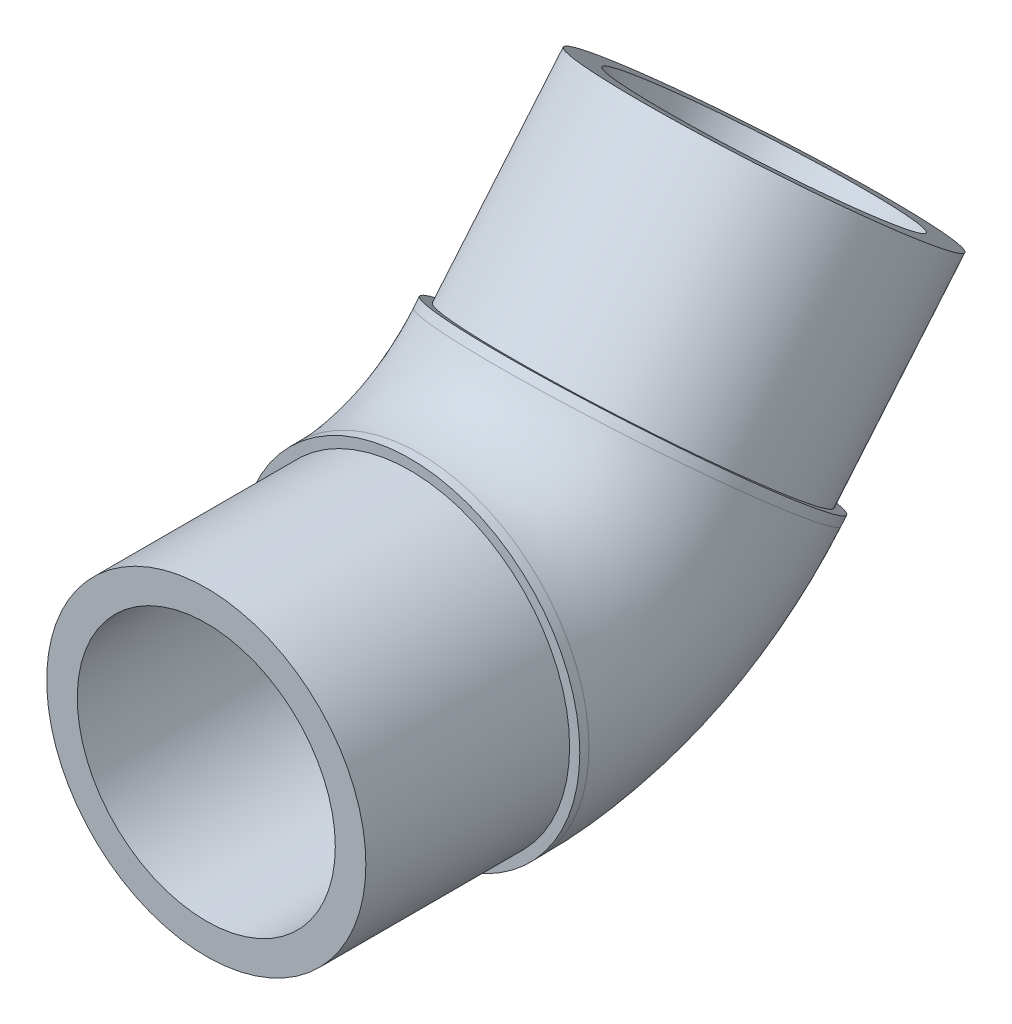
ISO-10303-21;
HEADER;
FILE_DESCRIPTION(('STEP AP214'),'2;1');
FILE_NAME('part.step','',(''),(''),'','','');
FILE_SCHEMA(('AUTOMOTIVE_DESIGN { 1 0 10303 214 1 1 1 1 }'));
ENDSEC;
DATA;
#1=APPLICATION_CONTEXT('core data for automotive mechanical design processes');
#2=APPLICATION_PROTOCOL_DEFINITION('international standard','automotive_design',2000,#1);
#3=PRODUCT_CONTEXT('',#1,'mechanical');
#4=PRODUCT('Part','Part','',(#3));
#5=PRODUCT_RELATED_PRODUCT_CATEGORY('part','',(#4));
#6=PRODUCT_DEFINITION_FORMATION('','',#4);
#7=PRODUCT_DEFINITION_CONTEXT('part definition',#1,'design');
#8=PRODUCT_DEFINITION('design','',#6,#7);
#9=PRODUCT_DEFINITION_SHAPE('','',#8);
#10=(LENGTH_UNIT() NAMED_UNIT(*) SI_UNIT(.MILLI.,.METRE.));
#11=(NAMED_UNIT(*) PLANE_ANGLE_UNIT() SI_UNIT($,.RADIAN.));
#12=(NAMED_UNIT(*) SI_UNIT($,.STERADIAN.) SOLID_ANGLE_UNIT());
#13=UNCERTAINTY_MEASURE_WITH_UNIT(LENGTH_MEASURE(1.E-05),#10,'distance_accuracy_value','');
#14=(GEOMETRIC_REPRESENTATION_CONTEXT(3) GLOBAL_UNCERTAINTY_ASSIGNED_CONTEXT((#13)) GLOBAL_UNIT_ASSIGNED_CONTEXT((#10,
#11,#12)) REPRESENTATION_CONTEXT('',''));
#15=CARTESIAN_POINT('',(0.,0.,0.));
#16=DIRECTION('',(0.,0.,1.));
#17=DIRECTION('',(1.,0.,0.));
#18=AXIS2_PLACEMENT_3D('',#15,#16,#17);
#19=CARTESIAN_POINT('',(0.,14.2884956125385,-61.9894713985592));
#20=DIRECTION('',(0.,0.766044443118979,-0.642787609686538));
#21=DIRECTION('',(0.,0.642787609686538,0.76604444311898));
#22=AXIS2_PLACEMENT_3D('',#19,#20,#21);
#23=CYLINDRICAL_SURFACE('',#22,25.);
#24=CARTESIAN_POINT('',(0.,14.2884956125385,-61.9894713985592));
#25=DIRECTION('',(0.,-0.76604444311898,0.642787609686537));
#26=DIRECTION('',(1.,0.,0.));
#27=AXIS2_PLACEMENT_3D('',#24,#25,#26);
#28=CIRCLE('',#27,25.);
#29=CARTESIAN_POINT('',(0.,-1.78119462962494,-81.1405824765337));
#30=VERTEX_POINT('',#29);
#31=EDGE_CURVE('E50',#30,#30,#28,.T.);
#32=ORIENTED_EDGE('',*,*,#31,.F.);
#33=EDGE_LOOP('',(#32));
#34=FACE_BOUND('',#33,.T.);
#35=CARTESIAN_POINT('',(0.,15.3208888623796,-62.8557521937307));
#36=DIRECTION('',(0.,0.766044443118979,-0.642787609686538));
#37=DIRECTION('',(0.,0.642787609686538,0.766044443118979));
#38=AXIS2_PLACEMENT_3D('',#35,#36,#37);
#39=CIRCLE('',#38,25.);
#40=CARTESIAN_POINT('',(0.,31.3905791045431,-43.7046411157563));
#41=VERTEX_POINT('',#40);
#42=EDGE_CURVE('E34',#41,#41,#39,.T.);
#43=ORIENTED_EDGE('',*,*,#42,.F.);
#44=EDGE_LOOP('',(#43));
#45=FACE_BOUND('',#44,.T.);
#46=ADVANCED_FACE('F31',(#34,#45),#23,.T.);
#47=CARTESIAN_POINT('',(0.,38.302222155949,-82.1393804843269));
#48=DIRECTION('',(0.,-0.766044443118979,0.642787609686538));
#49=DIRECTION('',(1.,0.,0.));
#50=AXIS2_PLACEMENT_3D('',#47,#48,#49);
#51=PLANE('',#50);
#52=CARTESIAN_POINT('',(0.,38.302222155949,-82.1393804843269));
#53=DIRECTION('',(0.,-0.766044443118979,0.642787609686538));
#54=DIRECTION('',(1.,0.,0.));
#55=AXIS2_PLACEMENT_3D('',#52,#53,#54);
#56=CIRCLE('',#55,19.);
#57=CARTESIAN_POINT('',(19.,38.302222155949,-82.1393804843269));
#58=VERTEX_POINT('',#57);
#59=EDGE_CURVE('E10',#58,#58,#56,.F.);
#60=ORIENTED_EDGE('',*,*,#59,.F.);
#61=EDGE_LOOP('',(#60));
#62=FACE_BOUND('',#61,.T.);
#63=CARTESIAN_POINT('',(0.,38.302222155949,-82.1393804843269));
#64=DIRECTION('',(0.,0.766044443118979,-0.642787609686538));
#65=DIRECTION('',(0.,0.642787609686538,0.766044443118979));
#66=AXIS2_PLACEMENT_3D('',#63,#64,#65);
#67=CIRCLE('',#66,23.5);
#68=CARTESIAN_POINT('',(0.,53.4077309835826,-64.1373360710308));
#69=VERTEX_POINT('',#68);
#70=EDGE_CURVE('E66',#69,#69,#67,.T.);
#71=ORIENTED_EDGE('',*,*,#70,.T.);
#72=EDGE_LOOP('',(#71));
#73=FACE_BOUND('',#72,.T.);
#74=ADVANCED_FACE('F91',(#62,#73),#51,.F.);
#75=CARTESIAN_POINT('',(0.,0.,0.));
#76=DIRECTION('',(0.,0.,-1.));
#77=DIRECTION('',(-1.,0.,0.));
#78=AXIS2_PLACEMENT_3D('',#75,#76,#77);
#79=CYLINDRICAL_SURFACE('',#78,25.);
#80=CARTESIAN_POINT('',(0.,0.,-31.3476936738));
#81=DIRECTION('',(0.,0.,1.));
#82=DIRECTION('',(1.,0.,0.));
#83=AXIS2_PLACEMENT_3D('',#80,#81,#82);
#84=CIRCLE('',#83,25.);
#85=CARTESIAN_POINT('',(0.,-25.,-31.3476936738));
#86=VERTEX_POINT('',#85);
#87=EDGE_CURVE('E47',#86,#86,#84,.T.);
#88=ORIENTED_EDGE('',*,*,#87,.T.);
#89=EDGE_LOOP('',(#88));
#90=FACE_BOUND('',#89,.T.);
#91=CARTESIAN_POINT('',(0.,0.,-30.));
#92=DIRECTION('',(0.,0.,1.));
#93=DIRECTION('',(1.,0.,0.));
#94=AXIS2_PLACEMENT_3D('',#91,#92,#93);
#95=CIRCLE('',#94,25.);
#96=CARTESIAN_POINT('',(25.,0.,-30.));
#97=VERTEX_POINT('',#96);
#98=EDGE_CURVE('E51',#97,#97,#95,.T.);
#99=ORIENTED_EDGE('',*,*,#98,.F.);
#100=EDGE_LOOP('',(#99));
#101=FACE_BOUND('',#100,.T.);
#102=ADVANCED_FACE('F96',(#90,#101),#79,.T.);
#103=CARTESIAN_POINT('',(0.,0.,0.));
#104=DIRECTION('',(0.,0.,1.));
#105=DIRECTION('',(1.,0.,0.));
#106=AXIS2_PLACEMENT_3D('',#103,#104,#105);
#107=PLANE('',#106);
#108=CARTESIAN_POINT('',(0.,0.,0.));
#109=DIRECTION('',(0.,0.,1.));
#110=DIRECTION('',(1.,0.,0.));
#111=AXIS2_PLACEMENT_3D('',#108,#109,#110);
#112=CIRCLE('',#111,19.);
#113=CARTESIAN_POINT('',(19.,0.,0.));
#114=VERTEX_POINT('',#113);
#115=EDGE_CURVE('E53',#114,#114,#112,.F.);
#116=ORIENTED_EDGE('',*,*,#115,.T.);
#117=EDGE_LOOP('',(#116));
#118=FACE_BOUND('',#117,.T.);
#119=CARTESIAN_POINT('',(0.,0.,0.));
#120=DIRECTION('',(0.,0.,1.));
#121=DIRECTION('',(1.,0.,0.));
#122=AXIS2_PLACEMENT_3D('',#119,#120,#121);
#123=CIRCLE('',#122,23.5);
#124=CARTESIAN_POINT('',(23.5,0.,0.));
#125=VERTEX_POINT('',#124);
#126=EDGE_CURVE('E59',#125,#125,#123,.T.);
#127=ORIENTED_EDGE('',*,*,#126,.T.);
#128=EDGE_LOOP('',(#127));
#129=FACE_BOUND('',#128,.T.);
#130=ADVANCED_FACE('F87',(#118,#129),#107,.T.);
#131=CARTESIAN_POINT('',(0.,40.,-31.3476936738));
#132=DIRECTION('',(1.,0.,0.));
#133=DIRECTION('',(0.,0.,-1.));
#134=AXIS2_PLACEMENT_3D('',#131,#132,#133);
#135=TOROIDAL_SURFACE('',#134,40.,25.);
#136=CARTESIAN_POINT('',(0.,40.,-31.3476936738));
#137=DIRECTION('',(1.,0.,0.));
#138=DIRECTION('',(0.,0.,-1.));
#139=AXIS2_PLACEMENT_3D('',#136,#137,#138);
#140=CIRCLE('',#139,65.);
#141=EDGE_CURVE('',#86,#30,#140,.T.);
#142=ORIENTED_EDGE('',*,*,#87,.F.);
#143=ORIENTED_EDGE('',*,*,#31,.T.);
#144=ORIENTED_EDGE('',*,*,#141,.T.);
#145=ORIENTED_EDGE('',*,*,#141,.F.);
#146=EDGE_LOOP('',(#142,#144,#143,#145));
#147=FACE_BOUND('',#146,.T.);
#148=ADVANCED_FACE('F88',(#147),#135,.T.);
#149=CARTESIAN_POINT('',(0.,0.,0.));
#150=DIRECTION('',(0.,0.,-1.));
#151=DIRECTION('',(-1.,0.,0.));
#152=AXIS2_PLACEMENT_3D('',#149,#150,#151);
#153=CYLINDRICAL_SURFACE('',#152,19.);
#154=CARTESIAN_POINT('',(0.,0.,-31.3476936738));
#155=DIRECTION('',(0.,0.,1.));
#156=DIRECTION('',(1.,0.,0.));
#157=AXIS2_PLACEMENT_3D('',#154,#155,#156);
#158=CIRCLE('',#157,19.);
#159=CARTESIAN_POINT('',(0.,-19.,-31.3476936738));
#160=VERTEX_POINT('',#159);
#161=EDGE_CURVE('E43',#160,#160,#158,.F.);
#162=ORIENTED_EDGE('',*,*,#161,.T.);
#163=EDGE_LOOP('',(#162));
#164=FACE_BOUND('',#163,.T.);
#165=ORIENTED_EDGE('',*,*,#115,.F.);
#166=EDGE_LOOP('',(#165));
#167=FACE_BOUND('',#166,.T.);
#168=ADVANCED_FACE('F73',(#164,#167),#153,.F.);
#169=CARTESIAN_POINT('',(0.,40.,-31.3476936738));
#170=DIRECTION('',(1.,0.,0.));
#171=DIRECTION('',(0.,0.,-1.));
#172=AXIS2_PLACEMENT_3D('',#169,#170,#171);
#173=TOROIDAL_SURFACE('',#172,40.,19.);
#174=CARTESIAN_POINT('',(0.,14.2884956125385,-61.9894713985592));
#175=DIRECTION('',(0.,-0.76604444311898,0.642787609686537));
#176=DIRECTION('',(1.,0.,0.));
#177=AXIS2_PLACEMENT_3D('',#174,#175,#176);
#178=CIRCLE('',#177,19.);
#179=CARTESIAN_POINT('',(0.,2.07553102849429,-76.5443158178198));
#180=VERTEX_POINT('',#179);
#181=EDGE_CURVE('E38',#180,#180,#178,.F.);
#182=CARTESIAN_POINT('',(0.,40.,-31.3476936738));
#183=DIRECTION('',(1.,0.,0.));
#184=DIRECTION('',(0.,0.,-1.));
#185=AXIS2_PLACEMENT_3D('',#182,#183,#184);
#186=CIRCLE('',#185,59.);
#187=EDGE_CURVE('',#160,#180,#186,.T.);
#188=ORIENTED_EDGE('',*,*,#161,.F.);
#189=ORIENTED_EDGE('',*,*,#181,.T.);
#190=ORIENTED_EDGE('',*,*,#187,.T.);
#191=ORIENTED_EDGE('',*,*,#187,.F.);
#192=EDGE_LOOP('',(#188,#190,#189,#191));
#193=FACE_BOUND('',#192,.T.);
#194=ADVANCED_FACE('F76',(#193),#173,.F.);
#195=CARTESIAN_POINT('',(0.,14.2884956125385,-61.9894713985592));
#196=DIRECTION('',(0.,0.766044443118979,-0.642787609686538));
#197=DIRECTION('',(0.,0.642787609686538,0.76604444311898));
#198=AXIS2_PLACEMENT_3D('',#195,#196,#197);
#199=CYLINDRICAL_SURFACE('',#198,19.);
#200=ORIENTED_EDGE('',*,*,#59,.T.);
#201=EDGE_LOOP('',(#200));
#202=FACE_BOUND('',#201,.T.);
#203=ORIENTED_EDGE('',*,*,#181,.F.);
#204=EDGE_LOOP('',(#203));
#205=FACE_BOUND('',#204,.T.);
#206=ADVANCED_FACE('F78',(#202,#205),#199,.F.);
#207=CARTESIAN_POINT('',(0.,0.,-30.));
#208=DIRECTION('',(0.,0.,1.));
#209=DIRECTION('',(1.,0.,0.));
#210=AXIS2_PLACEMENT_3D('',#207,#208,#209);
#211=PLANE('',#210);
#212=CARTESIAN_POINT('',(0.,0.,-30.));
#213=DIRECTION('',(0.,0.,1.));
#214=DIRECTION('',(1.,0.,0.));
#215=AXIS2_PLACEMENT_3D('',#212,#213,#214);
#216=CIRCLE('',#215,23.5);
#217=CARTESIAN_POINT('',(23.5,0.,-30.));
#218=VERTEX_POINT('',#217);
#219=EDGE_CURVE('E55',#218,#218,#216,.T.);
#220=ORIENTED_EDGE('',*,*,#219,.F.);
#221=EDGE_LOOP('',(#220));
#222=FACE_BOUND('',#221,.T.);
#223=ORIENTED_EDGE('',*,*,#98,.T.);
#224=EDGE_LOOP('',(#223));
#225=FACE_BOUND('',#224,.T.);
#226=ADVANCED_FACE('F85',(#222,#225),#211,.T.);
#227=CARTESIAN_POINT('',(0.,0.,-30.));
#228=DIRECTION('',(0.,0.,1.));
#229=DIRECTION('',(1.,0.,0.));
#230=AXIS2_PLACEMENT_3D('',#227,#228,#229);
#231=CYLINDRICAL_SURFACE('',#230,23.5);
#232=ORIENTED_EDGE('',*,*,#219,.T.);
#233=EDGE_LOOP('',(#232));
#234=FACE_BOUND('',#233,.T.);
#235=ORIENTED_EDGE('',*,*,#126,.F.);
#236=EDGE_LOOP('',(#235));
#237=FACE_BOUND('',#236,.T.);
#238=ADVANCED_FACE('F119',(#234,#237),#231,.T.);
#239=CARTESIAN_POINT('',(0.,15.3208888623796,-62.8557521937307));
#240=DIRECTION('',(0.,0.766044443118979,-0.642787609686538));
#241=DIRECTION('',(0.,0.642787609686538,0.766044443118979));
#242=AXIS2_PLACEMENT_3D('',#239,#240,#241);
#243=PLANE('',#242);
#244=CARTESIAN_POINT('',(0.,15.3208888623796,-62.8557521937307));
#245=DIRECTION('',(0.,0.766044443118979,-0.642787609686538));
#246=DIRECTION('',(0.,0.642787609686538,0.766044443118979));
#247=AXIS2_PLACEMENT_3D('',#244,#245,#246);
#248=CIRCLE('',#247,23.5);
#249=CARTESIAN_POINT('',(0.,30.4263976900133,-44.8537077804347));
#250=VERTEX_POINT('',#249);
#251=EDGE_CURVE('E104',#250,#250,#248,.T.);
#252=ORIENTED_EDGE('',*,*,#251,.F.);
#253=EDGE_LOOP('',(#252));
#254=FACE_BOUND('',#253,.T.);
#255=ORIENTED_EDGE('',*,*,#42,.T.);
#256=EDGE_LOOP('',(#255));
#257=FACE_BOUND('',#256,.T.);
#258=ADVANCED_FACE('F114',(#254,#257),#243,.T.);
#259=CARTESIAN_POINT('',(0.,15.3208888623796,-62.8557521937307));
#260=DIRECTION('',(0.,0.766044443118979,-0.642787609686538));
#261=DIRECTION('',(0.,0.642787609686538,0.76604444311898));
#262=AXIS2_PLACEMENT_3D('',#259,#260,#261);
#263=CYLINDRICAL_SURFACE('',#262,23.5);
#264=ORIENTED_EDGE('',*,*,#251,.T.);
#265=EDGE_LOOP('',(#264));
#266=FACE_BOUND('',#265,.T.);
#267=ORIENTED_EDGE('',*,*,#70,.F.);
#268=EDGE_LOOP('',(#267));
#269=FACE_BOUND('',#268,.T.);
#270=ADVANCED_FACE('F112',(#266,#269),#263,.T.);
#271=CLOSED_SHELL('',(#46,#74,#102,#130,#148,#168,#194,#206,#226,#238,#258,#270));
#272=MANIFOLD_SOLID_BREP('B2',#271);
#273=ADVANCED_BREP_SHAPE_REPRESENTATION('',(#18,#272),#14);
#274=SHAPE_DEFINITION_REPRESENTATION(#9,#273);
ENDSEC;
END-ISO-10303-21;
